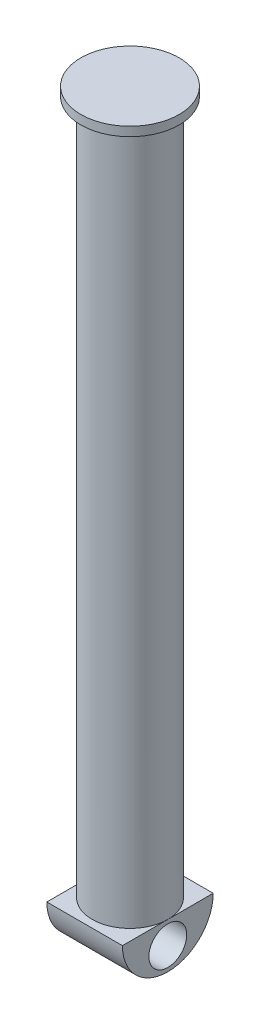
ISO-10303-21;
HEADER;
FILE_DESCRIPTION(('STEP AP214'),'2;1');
FILE_NAME('part.step','',(''),(''),'','','');
FILE_SCHEMA(('AUTOMOTIVE_DESIGN { 1 0 10303 214 1 1 1 1 }'));
ENDSEC;
DATA;
#1=APPLICATION_CONTEXT('core data for automotive mechanical design processes');
#2=APPLICATION_PROTOCOL_DEFINITION('international standard','automotive_design',2000,#1);
#3=PRODUCT_CONTEXT('',#1,'mechanical');
#4=PRODUCT('Part','Part','',(#3));
#5=PRODUCT_RELATED_PRODUCT_CATEGORY('part','',(#4));
#6=PRODUCT_DEFINITION_FORMATION('','',#4);
#7=PRODUCT_DEFINITION_CONTEXT('part definition',#1,'design');
#8=PRODUCT_DEFINITION('design','',#6,#7);
#9=PRODUCT_DEFINITION_SHAPE('','',#8);
#10=(LENGTH_UNIT() NAMED_UNIT(*) SI_UNIT(.MILLI.,.METRE.));
#11=(NAMED_UNIT(*) PLANE_ANGLE_UNIT() SI_UNIT($,.RADIAN.));
#12=(NAMED_UNIT(*) SI_UNIT($,.STERADIAN.) SOLID_ANGLE_UNIT());
#13=UNCERTAINTY_MEASURE_WITH_UNIT(LENGTH_MEASURE(1.E-05),#10,'distance_accuracy_value','');
#14=(GEOMETRIC_REPRESENTATION_CONTEXT(3) GLOBAL_UNCERTAINTY_ASSIGNED_CONTEXT((#13)) GLOBAL_UNIT_ASSIGNED_CONTEXT((#10,
#11,#12)) REPRESENTATION_CONTEXT('',''));
#15=CARTESIAN_POINT('',(0.,0.,0.));
#16=DIRECTION('',(0.,0.,1.));
#17=DIRECTION('',(1.,0.,0.));
#18=AXIS2_PLACEMENT_3D('',#15,#16,#17);
#19=CARTESIAN_POINT('',(0.,2.4,0.));
#20=DIRECTION('',(0.,-1.,0.));
#21=DIRECTION('',(0.,0.,-1.));
#22=AXIS2_PLACEMENT_3D('',#19,#20,#21);
#23=CYLINDRICAL_SURFACE('',#22,13.);
#24=CARTESIAN_POINT('',(0.,2.4,0.));
#25=DIRECTION('',(0.,1.,0.));
#26=DIRECTION('',(0.,0.,1.));
#27=AXIS2_PLACEMENT_3D('',#24,#25,#26);
#28=CIRCLE('',#27,13.);
#29=CARTESIAN_POINT('',(0.,2.4,13.));
#30=VERTEX_POINT('',#29);
#31=EDGE_CURVE('E56',#30,#30,#28,.T.);
#32=ORIENTED_EDGE('',*,*,#31,.F.);
#33=EDGE_LOOP('',(#32));
#34=FACE_BOUND('',#33,.T.);
#35=CARTESIAN_POINT('',(0.,0.,0.));
#36=DIRECTION('',(0.,1.,0.));
#37=DIRECTION('',(0.,0.,1.));
#38=AXIS2_PLACEMENT_3D('',#35,#36,#37);
#39=CIRCLE('',#38,13.);
#40=CARTESIAN_POINT('',(0.,0.,13.));
#41=VERTEX_POINT('',#40);
#42=EDGE_CURVE('E50',#41,#41,#39,.T.);
#43=ORIENTED_EDGE('',*,*,#42,.T.);
#44=EDGE_LOOP('',(#43));
#45=FACE_BOUND('',#44,.T.);
#46=ADVANCED_FACE('F47',(#34,#45),#23,.T.);
#47=CARTESIAN_POINT('',(0.,2.4,0.));
#48=DIRECTION('',(0.,1.,0.));
#49=DIRECTION('',(0.,0.,1.));
#50=AXIS2_PLACEMENT_3D('',#47,#48,#49);
#51=PLANE('',#50);
#52=ORIENTED_EDGE('',*,*,#31,.T.);
#53=EDGE_LOOP('',(#52));
#54=FACE_BOUND('',#53,.T.);
#55=ADVANCED_FACE('F139',(#54),#51,.T.);
#56=CARTESIAN_POINT('',(0.,0.,0.));
#57=DIRECTION('',(0.,1.,0.));
#58=DIRECTION('',(0.,0.,1.));
#59=AXIS2_PLACEMENT_3D('',#56,#57,#58);
#60=PLANE('',#59);
#61=CARTESIAN_POINT('',(0.,0.,0.));
#62=DIRECTION('',(0.,-1.,0.));
#63=DIRECTION('',(0.,0.,-1.));
#64=AXIS2_PLACEMENT_3D('',#61,#62,#63);
#65=CIRCLE('',#64,10.);
#66=CARTESIAN_POINT('',(0.,0.,-10.));
#67=VERTEX_POINT('',#66);
#68=EDGE_CURVE('E11',#67,#67,#65,.T.);
#69=ORIENTED_EDGE('',*,*,#68,.F.);
#70=EDGE_LOOP('',(#69));
#71=FACE_BOUND('',#70,.T.);
#72=ORIENTED_EDGE('',*,*,#42,.F.);
#73=EDGE_LOOP('',(#72));
#74=FACE_BOUND('',#73,.T.);
#75=ADVANCED_FACE('F136',(#71,#74),#60,.F.);
#76=CARTESIAN_POINT('',(0.,-183.48,0.));
#77=DIRECTION('',(0.,1.,0.));
#78=DIRECTION('',(0.,0.,1.));
#79=AXIS2_PLACEMENT_3D('',#76,#77,#78);
#80=CYLINDRICAL_SURFACE('',#79,10.);
#81=CARTESIAN_POINT('',(0.,-183.48,0.));
#82=DIRECTION('',(0.,-1.,0.));
#83=DIRECTION('',(0.,0.,-1.));
#84=AXIS2_PLACEMENT_3D('',#81,#82,#83);
#85=CIRCLE('',#84,10.);
#86=CARTESIAN_POINT('',(10.,-183.48,0.));
#87=VERTEX_POINT('',#86);
#88=CARTESIAN_POINT('',(-10.,-183.48,0.));
#89=VERTEX_POINT('',#88);
#90=EDGE_CURVE('E63',#87,#89,#85,.T.);
#91=ORIENTED_EDGE('',*,*,#90,.F.);
#92=EDGE_CURVE('E66',#89,#87,#85,.T.);
#93=ORIENTED_EDGE('',*,*,#92,.F.);
#94=EDGE_LOOP('',(#91,#93));
#95=FACE_BOUND('',#94,.T.);
#96=ORIENTED_EDGE('',*,*,#68,.T.);
#97=EDGE_LOOP('',(#96));
#98=FACE_BOUND('',#97,.T.);
#99=ADVANCED_FACE('F138',(#95,#98),#80,.T.);
#100=CARTESIAN_POINT('',(-10.,-183.48,12.0000000000001));
#101=DIRECTION('',(0.,1.,0.));
#102=DIRECTION('',(0.,0.,1.));
#103=AXIS2_PLACEMENT_3D('',#100,#101,#102);
#104=PLANE('',#103);
#105=ORIENTED_EDGE('',*,*,#92,.T.);
#106=DIRECTION('',(0.,0.,1.));
#107=VECTOR('',#106,1.);
#108=CARTESIAN_POINT('',(10.,-183.48,12.0000000000001));
#109=LINE('',#108,#107);
#110=CARTESIAN_POINT('',(10.,-183.48,-11.9999999999999));
#111=VERTEX_POINT('',#110);
#112=EDGE_CURVE('E97',#111,#87,#109,.T.);
#113=ORIENTED_EDGE('',*,*,#112,.F.);
#114=DIRECTION('',(1.,0.,0.));
#115=VECTOR('',#114,1.);
#116=CARTESIAN_POINT('',(-10.,-183.48,-11.9999999999999));
#117=LINE('',#116,#115);
#118=CARTESIAN_POINT('',(-10.,-183.48,-11.9999999999999));
#119=VERTEX_POINT('',#118);
#120=EDGE_CURVE('E81',#119,#111,#117,.T.);
#121=ORIENTED_EDGE('',*,*,#120,.F.);
#122=DIRECTION('',(0.,0.,1.));
#123=VECTOR('',#122,1.);
#124=CARTESIAN_POINT('',(-10.,-183.48,12.0000000000001));
#125=LINE('',#124,#123);
#126=EDGE_CURVE('E94',#119,#89,#125,.T.);
#127=ORIENTED_EDGE('',*,*,#126,.T.);
#128=EDGE_LOOP('',(#105,#113,#121,#127));
#129=FACE_BOUND('',#128,.T.);
#130=ADVANCED_FACE('F98',(#129),#104,.T.);
#131=CARTESIAN_POINT('',(-10.,-183.48,0.));
#132=DIRECTION('',(1.,0.,0.));
#133=DIRECTION('',(0.,0.,-1.));
#134=AXIS2_PLACEMENT_3D('',#131,#132,#133);
#135=CYLINDRICAL_SURFACE('',#134,12.);
#136=ORIENTED_EDGE('',*,*,#120,.T.);
#137=CARTESIAN_POINT('',(10.,-183.48,0.));
#138=DIRECTION('',(1.,0.,0.));
#139=DIRECTION('',(0.,0.,-1.));
#140=AXIS2_PLACEMENT_3D('',#137,#138,#139);
#141=CIRCLE('',#140,12.);
#142=CARTESIAN_POINT('',(10.,-183.48,12.0000000000001));
#143=VERTEX_POINT('',#142);
#144=EDGE_CURVE('E86',#143,#111,#141,.T.);
#145=ORIENTED_EDGE('',*,*,#144,.F.);
#146=DIRECTION('',(1.,0.,0.));
#147=VECTOR('',#146,1.);
#148=CARTESIAN_POINT('',(-10.,-183.48,12.0000000000001));
#149=LINE('',#148,#147);
#150=CARTESIAN_POINT('',(-10.,-183.48,12.0000000000001));
#151=VERTEX_POINT('',#150);
#152=EDGE_CURVE('E93',#151,#143,#149,.T.);
#153=ORIENTED_EDGE('',*,*,#152,.F.);
#154=CARTESIAN_POINT('',(-10.,-183.48,0.));
#155=DIRECTION('',(1.,0.,0.));
#156=DIRECTION('',(0.,0.,-1.));
#157=AXIS2_PLACEMENT_3D('',#154,#155,#156);
#158=CIRCLE('',#157,12.);
#159=EDGE_CURVE('E88',#151,#119,#158,.T.);
#160=ORIENTED_EDGE('',*,*,#159,.T.);
#161=EDGE_LOOP('',(#136,#145,#153,#160));
#162=FACE_BOUND('',#161,.T.);
#163=ADVANCED_FACE('F83',(#162),#135,.T.);
#164=ORIENTED_EDGE('',*,*,#90,.T.);
#165=EDGE_CURVE('E121',#89,#151,#125,.T.);
#166=ORIENTED_EDGE('',*,*,#165,.T.);
#167=ORIENTED_EDGE('',*,*,#152,.T.);
#168=EDGE_CURVE('E103',#87,#143,#109,.T.);
#169=ORIENTED_EDGE('',*,*,#168,.F.);
#170=EDGE_LOOP('',(#164,#166,#167,#169));
#171=FACE_BOUND('',#170,.T.);
#172=ADVANCED_FACE('F178',(#171),#104,.T.);
#173=CARTESIAN_POINT('',(-10.,-183.48,0.));
#174=DIRECTION('',(1.,0.,0.));
#175=DIRECTION('',(0.,0.,-1.));
#176=AXIS2_PLACEMENT_3D('',#173,#174,#175);
#177=PLANE('',#176);
#178=CARTESIAN_POINT('',(-10.,-189.48,0.));
#179=DIRECTION('',(1.,0.,0.));
#180=DIRECTION('',(0.,0.,-1.));
#181=AXIS2_PLACEMENT_3D('',#178,#179,#180);
#182=CIRCLE('',#181,5.00000000000001);
#183=CARTESIAN_POINT('',(-10.,-189.48,-4.99999999999992));
#184=VERTEX_POINT('',#183);
#185=EDGE_CURVE('E102',#184,#184,#182,.T.);
#186=ORIENTED_EDGE('',*,*,#185,.T.);
#187=EDGE_LOOP('',(#186));
#188=FACE_BOUND('',#187,.T.);
#189=ORIENTED_EDGE('',*,*,#159,.F.);
#190=ORIENTED_EDGE('',*,*,#165,.F.);
#191=ORIENTED_EDGE('',*,*,#126,.F.);
#192=EDGE_LOOP('',(#189,#190,#191));
#193=FACE_BOUND('',#192,.T.);
#194=ADVANCED_FACE('F194',(#188,#193),#177,.F.);
#195=CARTESIAN_POINT('',(-10.,-189.48,0.));
#196=DIRECTION('',(1.,0.,0.));
#197=DIRECTION('',(0.,0.,-1.));
#198=AXIS2_PLACEMENT_3D('',#195,#196,#197);
#199=CYLINDRICAL_SURFACE('',#198,5.00000000000001);
#200=ORIENTED_EDGE('',*,*,#185,.F.);
#201=EDGE_LOOP('',(#200));
#202=FACE_BOUND('',#201,.T.);
#203=CARTESIAN_POINT('',(10.,-189.48,0.));
#204=DIRECTION('',(1.,0.,0.));
#205=DIRECTION('',(0.,0.,-1.));
#206=AXIS2_PLACEMENT_3D('',#203,#204,#205);
#207=CIRCLE('',#206,5.00000000000001);
#208=CARTESIAN_POINT('',(10.,-189.48,-4.99999999999992));
#209=VERTEX_POINT('',#208);
#210=EDGE_CURVE('E109',#209,#209,#207,.T.);
#211=ORIENTED_EDGE('',*,*,#210,.T.);
#212=EDGE_LOOP('',(#211));
#213=FACE_BOUND('',#212,.T.);
#214=ADVANCED_FACE('F203',(#202,#213),#199,.F.);
#215=CARTESIAN_POINT('',(10.,-183.48,0.));
#216=DIRECTION('',(1.,0.,0.));
#217=DIRECTION('',(0.,0.,-1.));
#218=AXIS2_PLACEMENT_3D('',#215,#216,#217);
#219=PLANE('',#218);
#220=ORIENTED_EDGE('',*,*,#144,.T.);
#221=ORIENTED_EDGE('',*,*,#112,.T.);
#222=ORIENTED_EDGE('',*,*,#168,.T.);
#223=EDGE_LOOP('',(#220,#221,#222));
#224=FACE_BOUND('',#223,.T.);
#225=ORIENTED_EDGE('',*,*,#210,.F.);
#226=EDGE_LOOP('',(#225));
#227=FACE_BOUND('',#226,.T.);
#228=ADVANCED_FACE('F105',(#224,#227),#219,.T.);
#229=CLOSED_SHELL('',(#46,#55,#75,#99,#130,#163,#172,#194,#214,#228));
#230=MANIFOLD_SOLID_BREP('B2',#229);
#231=ADVANCED_BREP_SHAPE_REPRESENTATION('',(#18,#230),#14);
#232=SHAPE_DEFINITION_REPRESENTATION(#9,#231);
ENDSEC;
END-ISO-10303-21;
